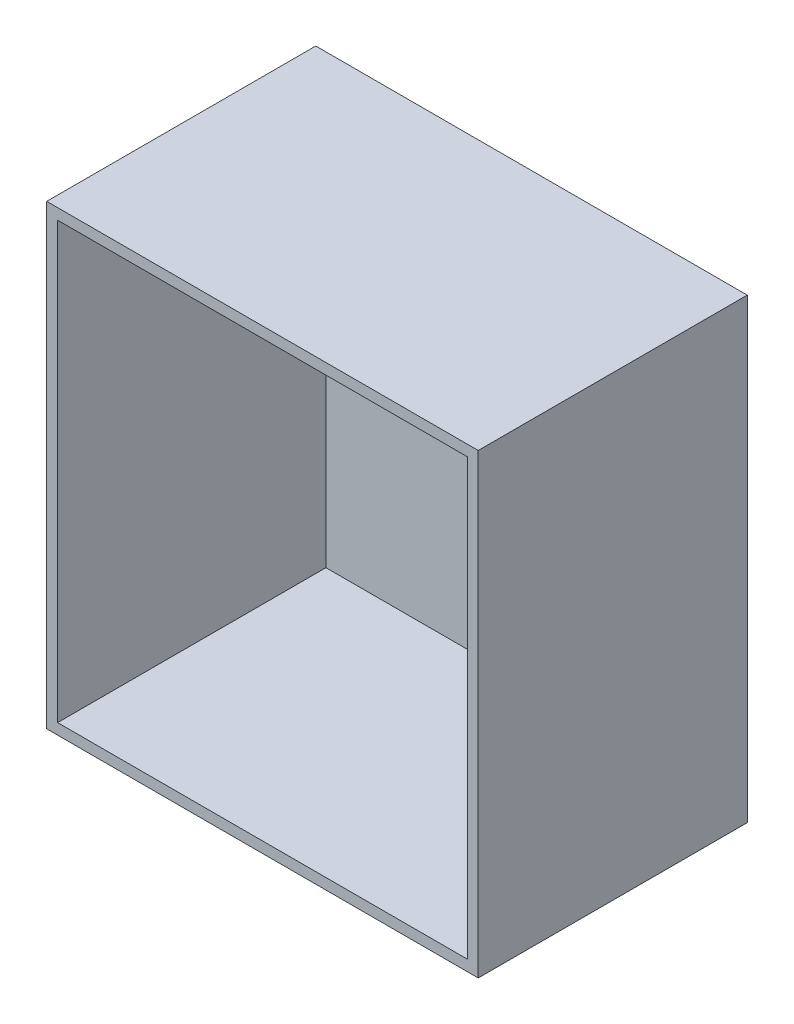
ISO-10303-21;
HEADER;
FILE_DESCRIPTION(('STEP AP214'),'2;1');
FILE_NAME('part.step','',(''),(''),'','','');
FILE_SCHEMA(('AUTOMOTIVE_DESIGN { 1 0 10303 214 1 1 1 1 }'));
ENDSEC;
DATA;
#1=APPLICATION_CONTEXT('core data for automotive mechanical design processes');
#2=APPLICATION_PROTOCOL_DEFINITION('international standard','automotive_design',2000,#1);
#3=PRODUCT_CONTEXT('',#1,'mechanical');
#4=PRODUCT('Part','Part','',(#3));
#5=PRODUCT_RELATED_PRODUCT_CATEGORY('part','',(#4));
#6=PRODUCT_DEFINITION_FORMATION('','',#4);
#7=PRODUCT_DEFINITION_CONTEXT('part definition',#1,'design');
#8=PRODUCT_DEFINITION('design','',#6,#7);
#9=PRODUCT_DEFINITION_SHAPE('','',#8);
#10=(LENGTH_UNIT() NAMED_UNIT(*) SI_UNIT(.MILLI.,.METRE.));
#11=(NAMED_UNIT(*) PLANE_ANGLE_UNIT() SI_UNIT($,.RADIAN.));
#12=(NAMED_UNIT(*) SI_UNIT($,.STERADIAN.) SOLID_ANGLE_UNIT());
#13=UNCERTAINTY_MEASURE_WITH_UNIT(LENGTH_MEASURE(1.E-05),#10,'distance_accuracy_value','');
#14=(GEOMETRIC_REPRESENTATION_CONTEXT(3) GLOBAL_UNCERTAINTY_ASSIGNED_CONTEXT((#13)) GLOBAL_UNIT_ASSIGNED_CONTEXT((#10,
#11,#12)) REPRESENTATION_CONTEXT('',''));
#15=CARTESIAN_POINT('',(0.,0.,0.));
#16=DIRECTION('',(0.,0.,1.));
#17=DIRECTION('',(1.,0.,0.));
#18=AXIS2_PLACEMENT_3D('',#15,#16,#17);
#19=CARTESIAN_POINT('',(0.,0.,370.));
#20=DIRECTION('',(0.,0.,-1.));
#21=DIRECTION('',(-1.,0.,0.));
#22=AXIS2_PLACEMENT_3D('',#19,#20,#21);
#23=PLANE('',#22);
#24=DIRECTION('',(0.,-1.,0.));
#25=VECTOR('',#24,1.);
#26=CARTESIAN_POINT('',(-297.5,-315.,370.));
#27=LINE('',#26,#25);
#28=CARTESIAN_POINT('',(-297.5,315.,370.));
#29=VERTEX_POINT('',#28);
#30=CARTESIAN_POINT('',(-297.5,-315.,370.));
#31=VERTEX_POINT('',#30);
#32=EDGE_CURVE('E149',#29,#31,#27,.T.);
#33=ORIENTED_EDGE('',*,*,#32,.T.);
#34=DIRECTION('',(1.,0.,0.));
#35=VECTOR('',#34,1.);
#36=CARTESIAN_POINT('',(-297.5,-315.,370.));
#37=LINE('',#36,#35);
#38=CARTESIAN_POINT('',(297.5,-315.,370.));
#39=VERTEX_POINT('',#38);
#40=EDGE_CURVE('E103',#31,#39,#37,.T.);
#41=ORIENTED_EDGE('',*,*,#40,.T.);
#42=DIRECTION('',(0.,1.,0.));
#43=VECTOR('',#42,1.);
#44=CARTESIAN_POINT('',(297.5,-315.,370.));
#45=LINE('',#44,#43);
#46=CARTESIAN_POINT('',(297.5,315.,370.));
#47=VERTEX_POINT('',#46);
#48=EDGE_CURVE('E152',#39,#47,#45,.T.);
#49=ORIENTED_EDGE('',*,*,#48,.T.);
#50=DIRECTION('',(-1.,0.,0.));
#51=VECTOR('',#50,1.);
#52=CARTESIAN_POINT('',(-297.5,315.,370.));
#53=LINE('',#52,#51);
#54=EDGE_CURVE('E154',#47,#29,#53,.T.);
#55=ORIENTED_EDGE('',*,*,#54,.T.);
#56=EDGE_LOOP('',(#33,#41,#49,#55));
#57=FACE_BOUND('',#56,.T.);
#58=DIRECTION('',(0.,1.,0.));
#59=VECTOR('',#58,1.);
#60=CARTESIAN_POINT('',(282.5,-300.,370.));
#61=LINE('',#60,#59);
#62=CARTESIAN_POINT('',(282.5,-300.,370.));
#63=VERTEX_POINT('',#62);
#64=CARTESIAN_POINT('',(282.5,300.,370.));
#65=VERTEX_POINT('',#64);
#66=EDGE_CURVE('E124',#63,#65,#61,.T.);
#67=ORIENTED_EDGE('',*,*,#66,.F.);
#68=DIRECTION('',(1.,0.,0.));
#69=VECTOR('',#68,1.);
#70=CARTESIAN_POINT('',(-282.5,-300.,370.));
#71=LINE('',#70,#69);
#72=CARTESIAN_POINT('',(-282.5,-300.,370.));
#73=VERTEX_POINT('',#72);
#74=EDGE_CURVE('E131',#73,#63,#71,.T.);
#75=ORIENTED_EDGE('',*,*,#74,.F.);
#76=DIRECTION('',(0.,-1.,0.));
#77=VECTOR('',#76,1.);
#78=CARTESIAN_POINT('',(-282.5,-300.,370.));
#79=LINE('',#78,#77);
#80=CARTESIAN_POINT('',(-282.5,300.,370.));
#81=VERTEX_POINT('',#80);
#82=EDGE_CURVE('E129',#81,#73,#79,.T.);
#83=ORIENTED_EDGE('',*,*,#82,.F.);
#84=DIRECTION('',(-1.,0.,0.));
#85=VECTOR('',#84,1.);
#86=CARTESIAN_POINT('',(-282.5,300.,370.));
#87=LINE('',#86,#85);
#88=EDGE_CURVE('E126',#65,#81,#87,.T.);
#89=ORIENTED_EDGE('',*,*,#88,.F.);
#90=EDGE_LOOP('',(#67,#75,#83,#89));
#91=FACE_BOUND('',#90,.T.);
#92=ADVANCED_FACE('F32',(#57,#91),#23,.F.);
#93=CARTESIAN_POINT('',(-297.5,-315.,370.));
#94=DIRECTION('',(1.,0.,0.));
#95=DIRECTION('',(0.,0.,-1.));
#96=AXIS2_PLACEMENT_3D('',#93,#94,#95);
#97=PLANE('',#96);
#98=DIRECTION('',(0.,0.,-1.));
#99=VECTOR('',#98,1.);
#100=CARTESIAN_POINT('',(-297.5,315.,370.));
#101=LINE('',#100,#99);
#102=CARTESIAN_POINT('',(-297.5,315.,-1.));
#103=VERTEX_POINT('',#102);
#104=EDGE_CURVE('E110',#29,#103,#101,.T.);
#105=ORIENTED_EDGE('',*,*,#104,.T.);
#106=DIRECTION('',(0.,1.,0.));
#107=VECTOR('',#106,1.);
#108=CARTESIAN_POINT('',(-297.5,-315.,-1.));
#109=LINE('',#108,#107);
#110=CARTESIAN_POINT('',(-297.5,-315.,-1.));
#111=VERTEX_POINT('',#110);
#112=EDGE_CURVE('E108',#111,#103,#109,.T.);
#113=ORIENTED_EDGE('',*,*,#112,.F.);
#114=DIRECTION('',(0.,0.,-1.));
#115=VECTOR('',#114,1.);
#116=CARTESIAN_POINT('',(-297.5,-315.,370.));
#117=LINE('',#116,#115);
#118=EDGE_CURVE('E11',#31,#111,#117,.T.);
#119=ORIENTED_EDGE('',*,*,#118,.F.);
#120=ORIENTED_EDGE('',*,*,#32,.F.);
#121=EDGE_LOOP('',(#105,#113,#119,#120));
#122=FACE_BOUND('',#121,.T.);
#123=ADVANCED_FACE('F34',(#122),#97,.F.);
#124=CARTESIAN_POINT('',(-297.5,-315.,370.));
#125=DIRECTION('',(0.,1.,0.));
#126=DIRECTION('',(0.,0.,1.));
#127=AXIS2_PLACEMENT_3D('',#124,#125,#126);
#128=PLANE('',#127);
#129=ORIENTED_EDGE('',*,*,#118,.T.);
#130=DIRECTION('',(-1.,0.,0.));
#131=VECTOR('',#130,1.);
#132=CARTESIAN_POINT('',(297.5,-315.,-1.));
#133=LINE('',#132,#131);
#134=CARTESIAN_POINT('',(297.5,-315.,-1.));
#135=VERTEX_POINT('',#134);
#136=EDGE_CURVE('E102',#135,#111,#133,.T.);
#137=ORIENTED_EDGE('',*,*,#136,.F.);
#138=DIRECTION('',(0.,0.,-1.));
#139=VECTOR('',#138,1.);
#140=CARTESIAN_POINT('',(297.5,-315.,370.));
#141=LINE('',#140,#139);
#142=EDGE_CURVE('E40',#39,#135,#141,.T.);
#143=ORIENTED_EDGE('',*,*,#142,.F.);
#144=ORIENTED_EDGE('',*,*,#40,.F.);
#145=EDGE_LOOP('',(#129,#137,#143,#144));
#146=FACE_BOUND('',#145,.T.);
#147=ADVANCED_FACE('F99',(#146),#128,.F.);
#148=CARTESIAN_POINT('',(297.5,-315.,370.));
#149=DIRECTION('',(-1.,0.,0.));
#150=DIRECTION('',(0.,0.,1.));
#151=AXIS2_PLACEMENT_3D('',#148,#149,#150);
#152=PLANE('',#151);
#153=ORIENTED_EDGE('',*,*,#142,.T.);
#154=DIRECTION('',(0.,-1.,0.));
#155=VECTOR('',#154,1.);
#156=CARTESIAN_POINT('',(297.5,315.,-1.));
#157=LINE('',#156,#155);
#158=CARTESIAN_POINT('',(297.5,315.,-1.));
#159=VERTEX_POINT('',#158);
#160=EDGE_CURVE('E119',#159,#135,#157,.T.);
#161=ORIENTED_EDGE('',*,*,#160,.F.);
#162=DIRECTION('',(0.,0.,-1.));
#163=VECTOR('',#162,1.);
#164=CARTESIAN_POINT('',(297.5,315.,370.));
#165=LINE('',#164,#163);
#166=EDGE_CURVE('E157',#47,#159,#165,.T.);
#167=ORIENTED_EDGE('',*,*,#166,.F.);
#168=ORIENTED_EDGE('',*,*,#48,.F.);
#169=EDGE_LOOP('',(#153,#161,#167,#168));
#170=FACE_BOUND('',#169,.T.);
#171=ADVANCED_FACE('F160',(#170),#152,.F.);
#172=CARTESIAN_POINT('',(-297.5,315.,370.));
#173=DIRECTION('',(0.,-1.,0.));
#174=DIRECTION('',(1.,0.,0.));
#175=AXIS2_PLACEMENT_3D('',#172,#173,#174);
#176=PLANE('',#175);
#177=ORIENTED_EDGE('',*,*,#166,.T.);
#178=DIRECTION('',(1.,0.,0.));
#179=VECTOR('',#178,1.);
#180=CARTESIAN_POINT('',(-297.5,315.,-1.));
#181=LINE('',#180,#179);
#182=EDGE_CURVE('E114',#103,#159,#181,.T.);
#183=ORIENTED_EDGE('',*,*,#182,.F.);
#184=ORIENTED_EDGE('',*,*,#104,.F.);
#185=ORIENTED_EDGE('',*,*,#54,.F.);
#186=EDGE_LOOP('',(#177,#183,#184,#185));
#187=FACE_BOUND('',#186,.T.);
#188=ADVANCED_FACE('F166',(#187),#176,.F.);
#189=CARTESIAN_POINT('',(282.5,-300.,370.));
#190=DIRECTION('',(-1.,0.,0.));
#191=DIRECTION('',(0.,0.,1.));
#192=AXIS2_PLACEMENT_3D('',#189,#190,#191);
#193=PLANE('',#192);
#194=DIRECTION('',(0.,1.,0.));
#195=VECTOR('',#194,1.);
#196=CARTESIAN_POINT('',(282.5,-300.,0.));
#197=LINE('',#196,#195);
#198=CARTESIAN_POINT('',(282.5,-300.,0.));
#199=VERTEX_POINT('',#198);
#200=CARTESIAN_POINT('',(282.5,300.,0.));
#201=VERTEX_POINT('',#200);
#202=EDGE_CURVE('E55',#199,#201,#197,.T.);
#203=ORIENTED_EDGE('',*,*,#202,.F.);
#204=DIRECTION('',(0.,0.,-1.));
#205=VECTOR('',#204,1.);
#206=CARTESIAN_POINT('',(282.5,-300.,370.));
#207=LINE('',#206,#205);
#208=EDGE_CURVE('E133',#63,#199,#207,.T.);
#209=ORIENTED_EDGE('',*,*,#208,.F.);
#210=ORIENTED_EDGE('',*,*,#66,.T.);
#211=DIRECTION('',(0.,0.,-1.));
#212=VECTOR('',#211,1.);
#213=CARTESIAN_POINT('',(282.5,300.,370.));
#214=LINE('',#213,#212);
#215=EDGE_CURVE('E147',#65,#201,#214,.T.);
#216=ORIENTED_EDGE('',*,*,#215,.T.);
#217=EDGE_LOOP('',(#203,#209,#210,#216));
#218=FACE_BOUND('',#217,.T.);
#219=ADVANCED_FACE('F168',(#218),#193,.T.);
#220=CARTESIAN_POINT('',(-282.5,300.,370.));
#221=DIRECTION('',(0.,-1.,0.));
#222=DIRECTION('',(0.,0.,-1.));
#223=AXIS2_PLACEMENT_3D('',#220,#221,#222);
#224=PLANE('',#223);
#225=DIRECTION('',(-1.,0.,0.));
#226=VECTOR('',#225,1.);
#227=CARTESIAN_POINT('',(-282.5,300.,0.));
#228=LINE('',#227,#226);
#229=CARTESIAN_POINT('',(-282.5,300.,0.));
#230=VERTEX_POINT('',#229);
#231=EDGE_CURVE('E135',#201,#230,#228,.T.);
#232=ORIENTED_EDGE('',*,*,#231,.F.);
#233=ORIENTED_EDGE('',*,*,#215,.F.);
#234=ORIENTED_EDGE('',*,*,#88,.T.);
#235=DIRECTION('',(0.,0.,-1.));
#236=VECTOR('',#235,1.);
#237=CARTESIAN_POINT('',(-282.5,300.,370.));
#238=LINE('',#237,#236);
#239=EDGE_CURVE('E145',#81,#230,#238,.T.);
#240=ORIENTED_EDGE('',*,*,#239,.T.);
#241=EDGE_LOOP('',(#232,#233,#234,#240));
#242=FACE_BOUND('',#241,.T.);
#243=ADVANCED_FACE('F174',(#242),#224,.T.);
#244=CARTESIAN_POINT('',(-282.5,-300.,370.));
#245=DIRECTION('',(1.,0.,0.));
#246=DIRECTION('',(0.,0.,-1.));
#247=AXIS2_PLACEMENT_3D('',#244,#245,#246);
#248=PLANE('',#247);
#249=DIRECTION('',(0.,-1.,0.));
#250=VECTOR('',#249,1.);
#251=CARTESIAN_POINT('',(-282.5,-300.,0.));
#252=LINE('',#251,#250);
#253=CARTESIAN_POINT('',(-282.5,-300.,0.));
#254=VERTEX_POINT('',#253);
#255=EDGE_CURVE('E138',#230,#254,#252,.T.);
#256=ORIENTED_EDGE('',*,*,#255,.F.);
#257=ORIENTED_EDGE('',*,*,#239,.F.);
#258=ORIENTED_EDGE('',*,*,#82,.T.);
#259=DIRECTION('',(0.,0.,-1.));
#260=VECTOR('',#259,1.);
#261=CARTESIAN_POINT('',(-282.5,-300.,370.));
#262=LINE('',#261,#260);
#263=EDGE_CURVE('E47',#73,#254,#262,.T.);
#264=ORIENTED_EDGE('',*,*,#263,.T.);
#265=EDGE_LOOP('',(#256,#257,#258,#264));
#266=FACE_BOUND('',#265,.T.);
#267=ADVANCED_FACE('F185',(#266),#248,.T.);
#268=CARTESIAN_POINT('',(-282.5,-300.,370.));
#269=DIRECTION('',(0.,1.,0.));
#270=DIRECTION('',(0.,0.,1.));
#271=AXIS2_PLACEMENT_3D('',#268,#269,#270);
#272=PLANE('',#271);
#273=DIRECTION('',(1.,0.,0.));
#274=VECTOR('',#273,1.);
#275=CARTESIAN_POINT('',(-282.5,-300.,0.));
#276=LINE('',#275,#274);
#277=EDGE_CURVE('E127',#254,#199,#276,.T.);
#278=ORIENTED_EDGE('',*,*,#277,.F.);
#279=ORIENTED_EDGE('',*,*,#263,.F.);
#280=ORIENTED_EDGE('',*,*,#74,.T.);
#281=ORIENTED_EDGE('',*,*,#208,.T.);
#282=EDGE_LOOP('',(#278,#279,#280,#281));
#283=FACE_BOUND('',#282,.T.);
#284=ADVANCED_FACE('F189',(#283),#272,.T.);
#285=CARTESIAN_POINT('',(0.,0.,0.));
#286=DIRECTION('',(0.,0.,-1.));
#287=DIRECTION('',(-1.,0.,0.));
#288=AXIS2_PLACEMENT_3D('',#285,#286,#287);
#289=PLANE('',#288);
#290=ORIENTED_EDGE('',*,*,#255,.T.);
#291=ORIENTED_EDGE('',*,*,#277,.T.);
#292=ORIENTED_EDGE('',*,*,#202,.T.);
#293=ORIENTED_EDGE('',*,*,#231,.T.);
#294=EDGE_LOOP('',(#290,#291,#292,#293));
#295=FACE_BOUND('',#294,.T.);
#296=ADVANCED_FACE('F193',(#295),#289,.F.);
#297=CARTESIAN_POINT('',(0.,0.,-1.));
#298=DIRECTION('',(0.,0.,-1.));
#299=DIRECTION('',(-1.,0.,0.));
#300=AXIS2_PLACEMENT_3D('',#297,#298,#299);
#301=PLANE('',#300);
#302=ORIENTED_EDGE('',*,*,#136,.T.);
#303=ORIENTED_EDGE('',*,*,#112,.T.);
#304=ORIENTED_EDGE('',*,*,#182,.T.);
#305=ORIENTED_EDGE('',*,*,#160,.T.);
#306=EDGE_LOOP('',(#302,#303,#304,#305));
#307=FACE_BOUND('',#306,.T.);
#308=ADVANCED_FACE('F117',(#307),#301,.T.);
#309=CLOSED_SHELL('',(#92,#123,#147,#171,#188,#219,#243,#267,#284,#296,#308));
#310=MANIFOLD_SOLID_BREP('B2',#309);
#311=ADVANCED_BREP_SHAPE_REPRESENTATION('',(#18,#310),#14);
#312=SHAPE_DEFINITION_REPRESENTATION(#9,#311);
ENDSEC;
END-ISO-10303-21;
